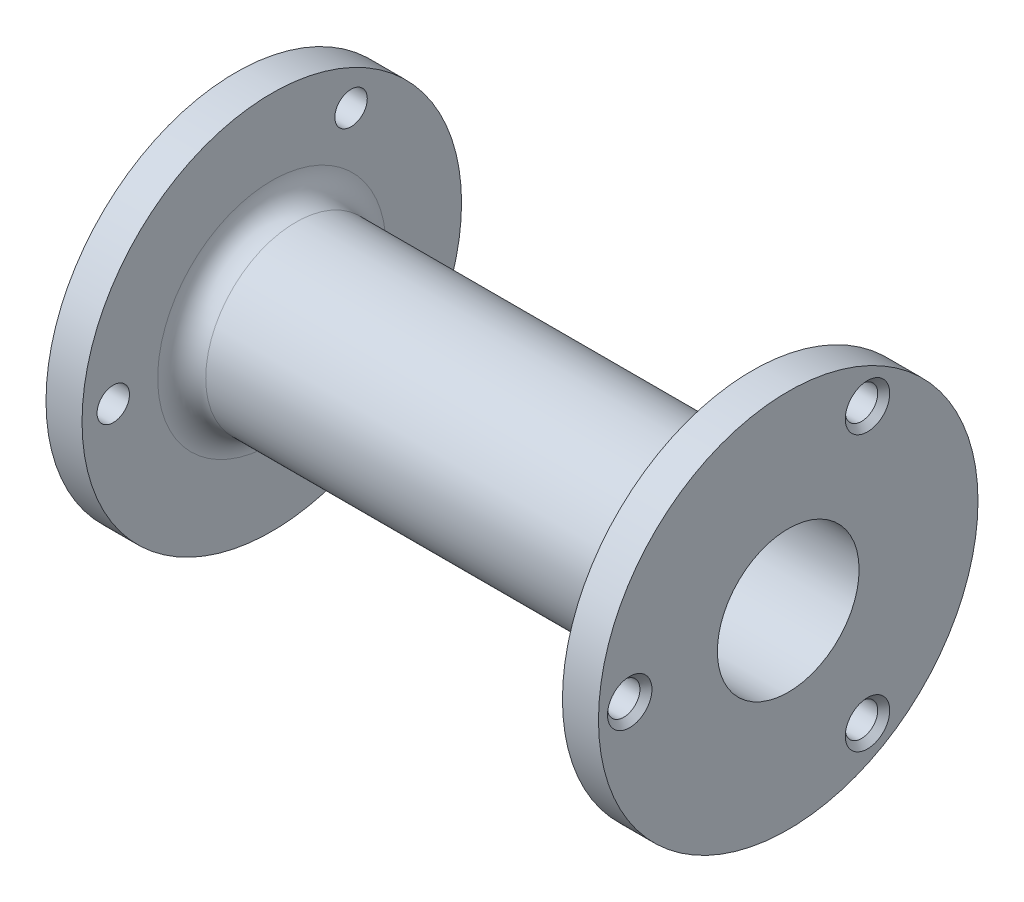
ISO-10303-21;
HEADER;
FILE_DESCRIPTION(('STEP AP214'),'2;1');
FILE_NAME('part.step','',(''),(''),'','','');
FILE_SCHEMA(('AUTOMOTIVE_DESIGN { 1 0 10303 214 1 1 1 1 }'));
ENDSEC;
DATA;
#1=APPLICATION_CONTEXT('core data for automotive mechanical design processes');
#2=APPLICATION_PROTOCOL_DEFINITION('international standard','automotive_design',2000,#1);
#3=PRODUCT_CONTEXT('',#1,'mechanical');
#4=PRODUCT('Part','Part','',(#3));
#5=PRODUCT_RELATED_PRODUCT_CATEGORY('part','',(#4));
#6=PRODUCT_DEFINITION_FORMATION('','',#4);
#7=PRODUCT_DEFINITION_CONTEXT('part definition',#1,'design');
#8=PRODUCT_DEFINITION('design','',#6,#7);
#9=PRODUCT_DEFINITION_SHAPE('','',#8);
#10=(LENGTH_UNIT() NAMED_UNIT(*) SI_UNIT(.MILLI.,.METRE.));
#11=(NAMED_UNIT(*) PLANE_ANGLE_UNIT() SI_UNIT($,.RADIAN.));
#12=(NAMED_UNIT(*) SI_UNIT($,.STERADIAN.) SOLID_ANGLE_UNIT());
#13=UNCERTAINTY_MEASURE_WITH_UNIT(LENGTH_MEASURE(1.E-05),#10,'distance_accuracy_value','');
#14=(GEOMETRIC_REPRESENTATION_CONTEXT(3) GLOBAL_UNCERTAINTY_ASSIGNED_CONTEXT((#13)) GLOBAL_UNIT_ASSIGNED_CONTEXT((#10,
#11,#12)) REPRESENTATION_CONTEXT('',''));
#15=CARTESIAN_POINT('',(0.,0.,0.));
#16=DIRECTION('',(0.,0.,1.));
#17=DIRECTION('',(1.,0.,0.));
#18=AXIS2_PLACEMENT_3D('',#15,#16,#17);
#19=CARTESIAN_POINT('',(0.,0.,0.));
#20=DIRECTION('',(1.,0.,0.));
#21=DIRECTION('',(0.,0.,-1.));
#22=AXIS2_PLACEMENT_3D('',#19,#20,#21);
#23=CYLINDRICAL_SURFACE('',#22,15.8);
#24=CARTESIAN_POINT('',(0.,0.,0.));
#25=DIRECTION('',(1.,0.,0.));
#26=DIRECTION('',(0.,0.,-1.));
#27=AXIS2_PLACEMENT_3D('',#24,#25,#26);
#28=CIRCLE('',#27,15.8);
#29=CARTESIAN_POINT('',(0.,0.,-15.8));
#30=VERTEX_POINT('',#29);
#31=EDGE_CURVE('E103',#30,#30,#28,.T.);
#32=ORIENTED_EDGE('',*,*,#31,.T.);
#33=EDGE_LOOP('',(#32));
#34=FACE_BOUND('',#33,.T.);
#35=CARTESIAN_POINT('',(3.,0.,0.));
#36=DIRECTION('',(1.,0.,0.));
#37=DIRECTION('',(0.,0.,-1.));
#38=AXIS2_PLACEMENT_3D('',#35,#36,#37);
#39=CIRCLE('',#38,15.8);
#40=CARTESIAN_POINT('',(3.,0.,-15.8));
#41=VERTEX_POINT('',#40);
#42=EDGE_CURVE('E76',#41,#41,#39,.T.);
#43=ORIENTED_EDGE('',*,*,#42,.F.);
#44=EDGE_LOOP('',(#43));
#45=FACE_BOUND('',#44,.T.);
#46=ADVANCED_FACE('F32',(#34,#45),#23,.T.);
#47=CARTESIAN_POINT('',(3.,15.8,0.));
#48=DIRECTION('',(1.,0.,0.));
#49=DIRECTION('',(0.,0.,-1.));
#50=AXIS2_PLACEMENT_3D('',#47,#48,#49);
#51=PLANE('',#50);
#52=CARTESIAN_POINT('',(3.,0.,13.2));
#53=DIRECTION('',(1.,0.,0.));
#54=DIRECTION('',(0.,0.,-1.));
#55=AXIS2_PLACEMENT_3D('',#52,#53,#54);
#56=CIRCLE('',#55,1.35);
#57=CARTESIAN_POINT('',(3.,0.,11.85));
#58=VERTEX_POINT('',#57);
#59=EDGE_CURVE('E106',#58,#58,#56,.T.);
#60=ORIENTED_EDGE('',*,*,#59,.F.);
#61=EDGE_LOOP('',(#60));
#62=FACE_BOUND('',#61,.T.);
#63=CARTESIAN_POINT('',(3.,11.4315353299546,-6.60000000000007));
#64=DIRECTION('',(1.,0.,0.));
#65=DIRECTION('',(0.,0.,-1.));
#66=AXIS2_PLACEMENT_3D('',#63,#64,#65);
#67=CIRCLE('',#66,1.35);
#68=CARTESIAN_POINT('',(3.,11.4315353299546,-7.95000000000007));
#69=VERTEX_POINT('',#68);
#70=EDGE_CURVE('E112',#69,#69,#67,.T.);
#71=ORIENTED_EDGE('',*,*,#70,.F.);
#72=EDGE_LOOP('',(#71));
#73=FACE_BOUND('',#72,.T.);
#74=CARTESIAN_POINT('',(3.,-11.4315353299547,-6.60000000000001));
#75=DIRECTION('',(1.,0.,0.));
#76=DIRECTION('',(0.,0.,-1.));
#77=AXIS2_PLACEMENT_3D('',#74,#75,#76);
#78=CIRCLE('',#77,1.35);
#79=CARTESIAN_POINT('',(3.,-11.4315353299547,-7.95000000000001));
#80=VERTEX_POINT('',#79);
#81=EDGE_CURVE('E118',#80,#80,#78,.T.);
#82=ORIENTED_EDGE('',*,*,#81,.F.);
#83=EDGE_LOOP('',(#82));
#84=FACE_BOUND('',#83,.T.);
#85=ORIENTED_EDGE('',*,*,#42,.T.);
#86=EDGE_LOOP('',(#85));
#87=FACE_BOUND('',#86,.T.);
#88=CARTESIAN_POINT('',(3.,0.,0.));
#89=DIRECTION('',(1.,0.,0.));
#90=DIRECTION('',(0.,0.,-1.));
#91=AXIS2_PLACEMENT_3D('',#88,#89,#90);
#92=CIRCLE('',#91,9.5);
#93=CARTESIAN_POINT('',(3.,0.,-9.5));
#94=VERTEX_POINT('',#93);
#95=EDGE_CURVE('E79',#94,#94,#92,.T.);
#96=ORIENTED_EDGE('',*,*,#95,.F.);
#97=EDGE_LOOP('',(#96));
#98=FACE_BOUND('',#97,.T.);
#99=ADVANCED_FACE('F166',(#62,#73,#84,#87,#98),#51,.T.);
#100=CARTESIAN_POINT('',(5.,0.,0.));
#101=DIRECTION('',(1.,0.,0.));
#102=DIRECTION('',(0.,0.,-1.));
#103=AXIS2_PLACEMENT_3D('',#100,#101,#102);
#104=TOROIDAL_SURFACE('',#103,9.5,2.);
#105=ORIENTED_EDGE('',*,*,#95,.T.);
#106=EDGE_LOOP('',(#105));
#107=FACE_BOUND('',#106,.T.);
#108=CARTESIAN_POINT('',(5.,0.,0.));
#109=DIRECTION('',(1.,0.,0.));
#110=DIRECTION('',(0.,0.,-1.));
#111=AXIS2_PLACEMENT_3D('',#108,#109,#110);
#112=CIRCLE('',#111,7.5);
#113=CARTESIAN_POINT('',(5.,0.,-7.5));
#114=VERTEX_POINT('',#113);
#115=EDGE_CURVE('E82',#114,#114,#112,.T.);
#116=ORIENTED_EDGE('',*,*,#115,.F.);
#117=EDGE_LOOP('',(#116));
#118=FACE_BOUND('',#117,.T.);
#119=ADVANCED_FACE('F172',(#107,#118),#104,.F.);
#120=CARTESIAN_POINT('',(0.,0.,0.));
#121=DIRECTION('',(1.,0.,0.));
#122=DIRECTION('',(0.,0.,-1.));
#123=AXIS2_PLACEMENT_3D('',#120,#121,#122);
#124=CYLINDRICAL_SURFACE('',#123,7.5);
#125=ORIENTED_EDGE('',*,*,#115,.T.);
#126=EDGE_LOOP('',(#125));
#127=FACE_BOUND('',#126,.T.);
#128=CARTESIAN_POINT('',(41.,0.,0.));
#129=DIRECTION('',(1.,0.,0.));
#130=DIRECTION('',(0.,0.,-1.));
#131=AXIS2_PLACEMENT_3D('',#128,#129,#130);
#132=CIRCLE('',#131,7.5);
#133=CARTESIAN_POINT('',(41.,0.,-7.5));
#134=VERTEX_POINT('',#133);
#135=EDGE_CURVE('E85',#134,#134,#132,.T.);
#136=ORIENTED_EDGE('',*,*,#135,.F.);
#137=EDGE_LOOP('',(#136));
#138=FACE_BOUND('',#137,.T.);
#139=ADVANCED_FACE('F179',(#127,#138),#124,.T.);
#140=CARTESIAN_POINT('',(41.,0.,0.));
#141=DIRECTION('',(1.,0.,0.));
#142=DIRECTION('',(0.,0.,-1.));
#143=AXIS2_PLACEMENT_3D('',#140,#141,#142);
#144=TOROIDAL_SURFACE('',#143,9.5,2.);
#145=ORIENTED_EDGE('',*,*,#135,.T.);
#146=EDGE_LOOP('',(#145));
#147=FACE_BOUND('',#146,.T.);
#148=CARTESIAN_POINT('',(43.,0.,0.));
#149=DIRECTION('',(1.,0.,0.));
#150=DIRECTION('',(0.,0.,-1.));
#151=AXIS2_PLACEMENT_3D('',#148,#149,#150);
#152=CIRCLE('',#151,9.5);
#153=CARTESIAN_POINT('',(43.,0.,-9.5));
#154=VERTEX_POINT('',#153);
#155=EDGE_CURVE('E88',#154,#154,#152,.T.);
#156=ORIENTED_EDGE('',*,*,#155,.F.);
#157=EDGE_LOOP('',(#156));
#158=FACE_BOUND('',#157,.T.);
#159=ADVANCED_FACE('F131',(#147,#158),#144,.F.);
#160=CARTESIAN_POINT('',(43.,9.5,0.));
#161=DIRECTION('',(-1.,0.,0.));
#162=DIRECTION('',(0.,0.,1.));
#163=AXIS2_PLACEMENT_3D('',#160,#161,#162);
#164=PLANE('',#163);
#165=CARTESIAN_POINT('',(43.,0.,13.2));
#166=DIRECTION('',(-1.,0.,0.));
#167=DIRECTION('',(0.,0.,1.));
#168=AXIS2_PLACEMENT_3D('',#165,#166,#167);
#169=CIRCLE('',#168,1.35);
#170=CARTESIAN_POINT('',(43.,0.,14.55));
#171=VERTEX_POINT('',#170);
#172=EDGE_CURVE('E109',#171,#171,#169,.T.);
#173=ORIENTED_EDGE('',*,*,#172,.F.);
#174=EDGE_LOOP('',(#173));
#175=FACE_BOUND('',#174,.T.);
#176=CARTESIAN_POINT('',(43.,11.4315353299546,-6.60000000000007));
#177=DIRECTION('',(-1.,0.,0.));
#178=DIRECTION('',(0.,0.,1.));
#179=AXIS2_PLACEMENT_3D('',#176,#177,#178);
#180=CIRCLE('',#179,1.35);
#181=CARTESIAN_POINT('',(43.,11.4315353299546,-5.25000000000007));
#182=VERTEX_POINT('',#181);
#183=EDGE_CURVE('E115',#182,#182,#180,.T.);
#184=ORIENTED_EDGE('',*,*,#183,.F.);
#185=EDGE_LOOP('',(#184));
#186=FACE_BOUND('',#185,.T.);
#187=CARTESIAN_POINT('',(43.,-11.4315353299547,-6.60000000000001));
#188=DIRECTION('',(-1.,0.,0.));
#189=DIRECTION('',(0.,0.,1.));
#190=AXIS2_PLACEMENT_3D('',#187,#188,#189);
#191=CIRCLE('',#190,1.35);
#192=CARTESIAN_POINT('',(43.,-11.4315353299547,-5.25000000000002));
#193=VERTEX_POINT('',#192);
#194=EDGE_CURVE('E121',#193,#193,#191,.T.);
#195=ORIENTED_EDGE('',*,*,#194,.F.);
#196=EDGE_LOOP('',(#195));
#197=FACE_BOUND('',#196,.T.);
#198=ORIENTED_EDGE('',*,*,#155,.T.);
#199=EDGE_LOOP('',(#198));
#200=FACE_BOUND('',#199,.T.);
#201=CARTESIAN_POINT('',(43.,0.,0.));
#202=DIRECTION('',(1.,0.,0.));
#203=DIRECTION('',(0.,0.,-1.));
#204=AXIS2_PLACEMENT_3D('',#201,#202,#203);
#205=CIRCLE('',#204,15.8);
#206=CARTESIAN_POINT('',(43.,0.,-15.8));
#207=VERTEX_POINT('',#206);
#208=EDGE_CURVE('E91',#207,#207,#205,.T.);
#209=ORIENTED_EDGE('',*,*,#208,.F.);
#210=EDGE_LOOP('',(#209));
#211=FACE_BOUND('',#210,.T.);
#212=ADVANCED_FACE('F127',(#175,#186,#197,#200,#211),#164,.T.);
#213=CARTESIAN_POINT('',(0.,0.,0.));
#214=DIRECTION('',(1.,0.,0.));
#215=DIRECTION('',(0.,0.,-1.));
#216=AXIS2_PLACEMENT_3D('',#213,#214,#215);
#217=CYLINDRICAL_SURFACE('',#216,15.8);
#218=ORIENTED_EDGE('',*,*,#208,.T.);
#219=EDGE_LOOP('',(#218));
#220=FACE_BOUND('',#219,.T.);
#221=CARTESIAN_POINT('',(46.,0.,0.));
#222=DIRECTION('',(1.,0.,0.));
#223=DIRECTION('',(0.,0.,-1.));
#224=AXIS2_PLACEMENT_3D('',#221,#222,#223);
#225=CIRCLE('',#224,15.8);
#226=CARTESIAN_POINT('',(46.,0.,-15.8));
#227=VERTEX_POINT('',#226);
#228=EDGE_CURVE('E94',#227,#227,#225,.T.);
#229=ORIENTED_EDGE('',*,*,#228,.F.);
#230=EDGE_LOOP('',(#229));
#231=FACE_BOUND('',#230,.T.);
#232=ADVANCED_FACE('F130',(#220,#231),#217,.T.);
#233=CARTESIAN_POINT('',(46.,15.8,0.));
#234=DIRECTION('',(1.,0.,0.));
#235=DIRECTION('',(0.,0.,-1.));
#236=AXIS2_PLACEMENT_3D('',#233,#234,#235);
#237=PLANE('',#236);
#238=CARTESIAN_POINT('',(46.,0.,13.2));
#239=DIRECTION('',(1.,0.,0.));
#240=DIRECTION('',(0.,0.,-1.));
#241=AXIS2_PLACEMENT_3D('',#238,#239,#240);
#242=CIRCLE('',#241,1.85000000000001);
#243=CARTESIAN_POINT('',(46.,0.,11.35));
#244=VERTEX_POINT('',#243);
#245=EDGE_CURVE('E43',#244,#244,#242,.F.);
#246=ORIENTED_EDGE('',*,*,#245,.T.);
#247=EDGE_LOOP('',(#246));
#248=FACE_BOUND('',#247,.T.);
#249=CARTESIAN_POINT('',(46.,-11.4315353299547,-6.60000000000001));
#250=DIRECTION('',(1.,0.,0.));
#251=DIRECTION('',(0.,0.,-1.));
#252=AXIS2_PLACEMENT_3D('',#249,#250,#251);
#253=CIRCLE('',#252,1.85);
#254=CARTESIAN_POINT('',(46.,-11.4315353299547,-8.45000000000002));
#255=VERTEX_POINT('',#254);
#256=EDGE_CURVE('E47',#255,#255,#253,.F.);
#257=ORIENTED_EDGE('',*,*,#256,.T.);
#258=EDGE_LOOP('',(#257));
#259=FACE_BOUND('',#258,.T.);
#260=CARTESIAN_POINT('',(46.,11.4315353299546,-6.60000000000007));
#261=DIRECTION('',(1.,0.,0.));
#262=DIRECTION('',(0.,0.,-1.));
#263=AXIS2_PLACEMENT_3D('',#260,#261,#262);
#264=CIRCLE('',#263,1.85);
#265=CARTESIAN_POINT('',(46.,11.4315353299546,-8.45000000000007));
#266=VERTEX_POINT('',#265);
#267=EDGE_CURVE('E52',#266,#266,#264,.F.);
#268=ORIENTED_EDGE('',*,*,#267,.T.);
#269=EDGE_LOOP('',(#268));
#270=FACE_BOUND('',#269,.T.);
#271=ORIENTED_EDGE('',*,*,#228,.T.);
#272=EDGE_LOOP('',(#271));
#273=FACE_BOUND('',#272,.T.);
#274=CARTESIAN_POINT('',(46.,0.,0.));
#275=DIRECTION('',(1.,0.,0.));
#276=DIRECTION('',(0.,0.,-1.));
#277=AXIS2_PLACEMENT_3D('',#274,#275,#276);
#278=CIRCLE('',#277,5.9);
#279=CARTESIAN_POINT('',(46.,0.,-5.9));
#280=VERTEX_POINT('',#279);
#281=EDGE_CURVE('E97',#280,#280,#278,.T.);
#282=ORIENTED_EDGE('',*,*,#281,.F.);
#283=EDGE_LOOP('',(#282));
#284=FACE_BOUND('',#283,.T.);
#285=ADVANCED_FACE('F140',(#248,#259,#270,#273,#284),#237,.T.);
#286=CARTESIAN_POINT('',(0.,0.,0.));
#287=DIRECTION('',(1.,0.,0.));
#288=DIRECTION('',(0.,0.,-1.));
#289=AXIS2_PLACEMENT_3D('',#286,#287,#288);
#290=CYLINDRICAL_SURFACE('',#289,5.9);
#291=ORIENTED_EDGE('',*,*,#281,.T.);
#292=EDGE_LOOP('',(#291));
#293=FACE_BOUND('',#292,.T.);
#294=CARTESIAN_POINT('',(0.,0.,0.));
#295=DIRECTION('',(1.,0.,0.));
#296=DIRECTION('',(0.,0.,-1.));
#297=AXIS2_PLACEMENT_3D('',#294,#295,#296);
#298=CIRCLE('',#297,5.9);
#299=CARTESIAN_POINT('',(0.,0.,-5.9));
#300=VERTEX_POINT('',#299);
#301=EDGE_CURVE('E100',#300,#300,#298,.T.);
#302=ORIENTED_EDGE('',*,*,#301,.F.);
#303=EDGE_LOOP('',(#302));
#304=FACE_BOUND('',#303,.T.);
#305=ADVANCED_FACE('F146',(#293,#304),#290,.F.);
#306=CARTESIAN_POINT('',(0.,5.9,0.));
#307=DIRECTION('',(-1.,0.,0.));
#308=DIRECTION('',(0.,0.,1.));
#309=AXIS2_PLACEMENT_3D('',#306,#307,#308);
#310=PLANE('',#309);
#311=CARTESIAN_POINT('',(0.,-11.4315353299547,-6.60000000000001));
#312=DIRECTION('',(-1.,0.,0.));
#313=DIRECTION('',(0.,0.,1.));
#314=AXIS2_PLACEMENT_3D('',#311,#312,#313);
#315=CIRCLE('',#314,1.84999999999999);
#316=CARTESIAN_POINT('',(0.,-11.4315353299547,-4.75000000000002));
#317=VERTEX_POINT('',#316);
#318=EDGE_CURVE('E67',#317,#317,#315,.F.);
#319=ORIENTED_EDGE('',*,*,#318,.T.);
#320=EDGE_LOOP('',(#319));
#321=FACE_BOUND('',#320,.T.);
#322=CARTESIAN_POINT('',(0.,11.4315353299546,-6.60000000000007));
#323=DIRECTION('',(-1.,0.,0.));
#324=DIRECTION('',(0.,0.,1.));
#325=AXIS2_PLACEMENT_3D('',#322,#323,#324);
#326=CIRCLE('',#325,1.84999999999999);
#327=CARTESIAN_POINT('',(0.,11.4315353299546,-4.75000000000008));
#328=VERTEX_POINT('',#327);
#329=EDGE_CURVE('E70',#328,#328,#326,.F.);
#330=ORIENTED_EDGE('',*,*,#329,.T.);
#331=EDGE_LOOP('',(#330));
#332=FACE_BOUND('',#331,.T.);
#333=CARTESIAN_POINT('',(0.,0.,13.2));
#334=DIRECTION('',(-1.,0.,0.));
#335=DIRECTION('',(0.,0.,1.));
#336=AXIS2_PLACEMENT_3D('',#333,#334,#335);
#337=CIRCLE('',#336,1.85);
#338=CARTESIAN_POINT('',(0.,0.,15.05));
#339=VERTEX_POINT('',#338);
#340=EDGE_CURVE('E73',#339,#339,#337,.F.);
#341=ORIENTED_EDGE('',*,*,#340,.T.);
#342=EDGE_LOOP('',(#341));
#343=FACE_BOUND('',#342,.T.);
#344=ORIENTED_EDGE('',*,*,#301,.T.);
#345=EDGE_LOOP('',(#344));
#346=FACE_BOUND('',#345,.T.);
#347=ORIENTED_EDGE('',*,*,#31,.F.);
#348=EDGE_LOOP('',(#347));
#349=FACE_BOUND('',#348,.T.);
#350=ADVANCED_FACE('F153',(#321,#332,#343,#346,#349),#310,.T.);
#351=CARTESIAN_POINT('',(0.,-11.4315353299547,-6.60000000000001));
#352=DIRECTION('',(1.,0.,0.));
#353=DIRECTION('',(0.,0.,-1.));
#354=AXIS2_PLACEMENT_3D('',#351,#352,#353);
#355=CYLINDRICAL_SURFACE('',#354,1.35);
#356=CARTESIAN_POINT('',(0.499999999999986,-11.4315353299547,-6.60000000000001));
#357=DIRECTION('',(-1.,0.,0.));
#358=DIRECTION('',(0.,0.,1.));
#359=AXIS2_PLACEMENT_3D('',#356,#357,#358);
#360=CIRCLE('',#359,1.35);
#361=CARTESIAN_POINT('',(0.499999999999986,-11.4315353299547,-5.25000000000002));
#362=VERTEX_POINT('',#361);
#363=EDGE_CURVE('E64',#362,#362,#360,.T.);
#364=ORIENTED_EDGE('',*,*,#363,.T.);
#365=EDGE_LOOP('',(#364));
#366=FACE_BOUND('',#365,.T.);
#367=ORIENTED_EDGE('',*,*,#81,.T.);
#368=EDGE_LOOP('',(#367));
#369=FACE_BOUND('',#368,.T.);
#370=ADVANCED_FACE('F159',(#366,#369),#355,.F.);
#371=CARTESIAN_POINT('',(0.,11.4315353299546,-6.60000000000007));
#372=DIRECTION('',(1.,0.,0.));
#373=DIRECTION('',(0.,0.,-1.));
#374=AXIS2_PLACEMENT_3D('',#371,#372,#373);
#375=CYLINDRICAL_SURFACE('',#374,1.35);
#376=CARTESIAN_POINT('',(0.499999999999986,11.4315353299546,-6.60000000000007));
#377=DIRECTION('',(-1.,0.,0.));
#378=DIRECTION('',(0.,0.,1.));
#379=AXIS2_PLACEMENT_3D('',#376,#377,#378);
#380=CIRCLE('',#379,1.35);
#381=CARTESIAN_POINT('',(0.499999999999986,11.4315353299546,-5.25000000000007));
#382=VERTEX_POINT('',#381);
#383=EDGE_CURVE('E61',#382,#382,#380,.T.);
#384=ORIENTED_EDGE('',*,*,#383,.T.);
#385=EDGE_LOOP('',(#384));
#386=FACE_BOUND('',#385,.T.);
#387=ORIENTED_EDGE('',*,*,#70,.T.);
#388=EDGE_LOOP('',(#387));
#389=FACE_BOUND('',#388,.T.);
#390=ADVANCED_FACE('F274',(#386,#389),#375,.F.);
#391=CARTESIAN_POINT('',(0.,0.,13.2));
#392=DIRECTION('',(1.,0.,0.));
#393=DIRECTION('',(0.,0.,-1.));
#394=AXIS2_PLACEMENT_3D('',#391,#392,#393);
#395=CYLINDRICAL_SURFACE('',#394,1.35);
#396=CARTESIAN_POINT('',(0.499999999999992,0.,13.2));
#397=DIRECTION('',(-1.,0.,0.));
#398=DIRECTION('',(0.,0.,1.));
#399=AXIS2_PLACEMENT_3D('',#396,#397,#398);
#400=CIRCLE('',#399,1.35);
#401=CARTESIAN_POINT('',(0.499999999999992,0.,14.55));
#402=VERTEX_POINT('',#401);
#403=EDGE_CURVE('E58',#402,#402,#400,.T.);
#404=ORIENTED_EDGE('',*,*,#403,.T.);
#405=EDGE_LOOP('',(#404));
#406=FACE_BOUND('',#405,.T.);
#407=ORIENTED_EDGE('',*,*,#59,.T.);
#408=EDGE_LOOP('',(#407));
#409=FACE_BOUND('',#408,.T.);
#410=ADVANCED_FACE('F265',(#406,#409),#395,.F.);
#411=CARTESIAN_POINT('',(45.5,-11.4315353299547,-6.60000000000001));
#412=DIRECTION('',(1.,0.,0.));
#413=DIRECTION('',(0.,0.,-1.));
#414=AXIS2_PLACEMENT_3D('',#411,#412,#413);
#415=CIRCLE('',#414,1.35);
#416=CARTESIAN_POINT('',(45.5,-11.4315353299547,-7.95000000000001));
#417=VERTEX_POINT('',#416);
#418=EDGE_CURVE('E39',#417,#417,#415,.T.);
#419=ORIENTED_EDGE('',*,*,#418,.T.);
#420=EDGE_LOOP('',(#419));
#421=FACE_BOUND('',#420,.T.);
#422=ORIENTED_EDGE('',*,*,#194,.T.);
#423=EDGE_LOOP('',(#422));
#424=FACE_BOUND('',#423,.T.);
#425=ADVANCED_FACE('F125',(#421,#424),#355,.F.);
#426=CARTESIAN_POINT('',(45.5,11.4315353299546,-6.60000000000007));
#427=DIRECTION('',(1.,0.,0.));
#428=DIRECTION('',(0.,0.,-1.));
#429=AXIS2_PLACEMENT_3D('',#426,#427,#428);
#430=CIRCLE('',#429,1.35);
#431=CARTESIAN_POINT('',(45.5,11.4315353299546,-7.95000000000007));
#432=VERTEX_POINT('',#431);
#433=EDGE_CURVE('E10',#432,#432,#430,.T.);
#434=ORIENTED_EDGE('',*,*,#433,.T.);
#435=EDGE_LOOP('',(#434));
#436=FACE_BOUND('',#435,.T.);
#437=ORIENTED_EDGE('',*,*,#183,.T.);
#438=EDGE_LOOP('',(#437));
#439=FACE_BOUND('',#438,.T.);
#440=ADVANCED_FACE('F262',(#436,#439),#375,.F.);
#441=CARTESIAN_POINT('',(45.5,0.,13.2));
#442=DIRECTION('',(1.,0.,0.));
#443=DIRECTION('',(0.,0.,-1.));
#444=AXIS2_PLACEMENT_3D('',#441,#442,#443);
#445=CIRCLE('',#444,1.35);
#446=CARTESIAN_POINT('',(45.5,0.,11.85));
#447=VERTEX_POINT('',#446);
#448=EDGE_CURVE('E55',#447,#447,#445,.T.);
#449=ORIENTED_EDGE('',*,*,#448,.T.);
#450=EDGE_LOOP('',(#449));
#451=FACE_BOUND('',#450,.T.);
#452=ORIENTED_EDGE('',*,*,#172,.T.);
#453=EDGE_LOOP('',(#452));
#454=FACE_BOUND('',#453,.T.);
#455=ADVANCED_FACE('F198',(#451,#454),#395,.F.);
#456=CARTESIAN_POINT('',(0.,-11.4315353299547,-6.60000000000001));
#457=DIRECTION('',(-1.,0.,0.));
#458=DIRECTION('',(0.,0.,1.));
#459=AXIS2_PLACEMENT_3D('',#456,#457,#458);
#460=CONICAL_SURFACE('',#459,1.84999999999999,0.785398163397453);
#461=ORIENTED_EDGE('',*,*,#363,.F.);
#462=EDGE_LOOP('',(#461));
#463=FACE_BOUND('',#462,.T.);
#464=ORIENTED_EDGE('',*,*,#318,.F.);
#465=EDGE_LOOP('',(#464));
#466=FACE_BOUND('',#465,.T.);
#467=ADVANCED_FACE('F194',(#463,#466),#460,.F.);
#468=CARTESIAN_POINT('',(0.,11.4315353299546,-6.60000000000007));
#469=DIRECTION('',(-1.,0.,0.));
#470=DIRECTION('',(0.,0.,1.));
#471=AXIS2_PLACEMENT_3D('',#468,#469,#470);
#472=CONICAL_SURFACE('',#471,1.84999999999999,0.785398163397453);
#473=ORIENTED_EDGE('',*,*,#383,.F.);
#474=EDGE_LOOP('',(#473));
#475=FACE_BOUND('',#474,.T.);
#476=ORIENTED_EDGE('',*,*,#329,.F.);
#477=EDGE_LOOP('',(#476));
#478=FACE_BOUND('',#477,.T.);
#479=ADVANCED_FACE('F197',(#475,#478),#472,.F.);
#480=CARTESIAN_POINT('',(0.,0.,13.2));
#481=DIRECTION('',(-1.,0.,0.));
#482=DIRECTION('',(0.,0.,1.));
#483=AXIS2_PLACEMENT_3D('',#480,#481,#482);
#484=CONICAL_SURFACE('',#483,1.85,0.785398163397453);
#485=ORIENTED_EDGE('',*,*,#403,.F.);
#486=EDGE_LOOP('',(#485));
#487=FACE_BOUND('',#486,.T.);
#488=ORIENTED_EDGE('',*,*,#340,.F.);
#489=EDGE_LOOP('',(#488));
#490=FACE_BOUND('',#489,.T.);
#491=ADVANCED_FACE('F202',(#487,#490),#484,.F.);
#492=CARTESIAN_POINT('',(45.5,0.,13.2));
#493=DIRECTION('',(1.,0.,0.));
#494=DIRECTION('',(0.,0.,-1.));
#495=AXIS2_PLACEMENT_3D('',#492,#493,#494);
#496=CONICAL_SURFACE('',#495,1.35,0.785398163397452);
#497=ORIENTED_EDGE('',*,*,#245,.F.);
#498=EDGE_LOOP('',(#497));
#499=FACE_BOUND('',#498,.T.);
#500=ORIENTED_EDGE('',*,*,#448,.F.);
#501=EDGE_LOOP('',(#500));
#502=FACE_BOUND('',#501,.T.);
#503=ADVANCED_FACE('F206',(#499,#502),#496,.F.);
#504=CARTESIAN_POINT('',(45.5,-11.4315353299547,-6.60000000000001));
#505=DIRECTION('',(1.,0.,0.));
#506=DIRECTION('',(0.,0.,-1.));
#507=AXIS2_PLACEMENT_3D('',#504,#505,#506);
#508=CONICAL_SURFACE('',#507,1.35,0.785398163397453);
#509=ORIENTED_EDGE('',*,*,#256,.F.);
#510=EDGE_LOOP('',(#509));
#511=FACE_BOUND('',#510,.T.);
#512=ORIENTED_EDGE('',*,*,#418,.F.);
#513=EDGE_LOOP('',(#512));
#514=FACE_BOUND('',#513,.T.);
#515=ADVANCED_FACE('F209',(#511,#514),#508,.F.);
#516=CARTESIAN_POINT('',(45.5,11.4315353299546,-6.60000000000007));
#517=DIRECTION('',(1.,0.,0.));
#518=DIRECTION('',(0.,0.,-1.));
#519=AXIS2_PLACEMENT_3D('',#516,#517,#518);
#520=CONICAL_SURFACE('',#519,1.35,0.785398163397453);
#521=ORIENTED_EDGE('',*,*,#267,.F.);
#522=EDGE_LOOP('',(#521));
#523=FACE_BOUND('',#522,.T.);
#524=ORIENTED_EDGE('',*,*,#433,.F.);
#525=EDGE_LOOP('',(#524));
#526=FACE_BOUND('',#525,.T.);
#527=ADVANCED_FACE('F34',(#523,#526),#520,.F.);
#528=CLOSED_SHELL('',(#46,#99,#119,#139,#159,#212,#232,#285,#305,#350,#370,#390,#410,#425,#440,
#455,#467,#479,#491,#503,#515,#527));
#529=MANIFOLD_SOLID_BREP('B2',#528);
#530=ADVANCED_BREP_SHAPE_REPRESENTATION('',(#18,#529),#14);
#531=SHAPE_DEFINITION_REPRESENTATION(#9,#530);
ENDSEC;
END-ISO-10303-21;
